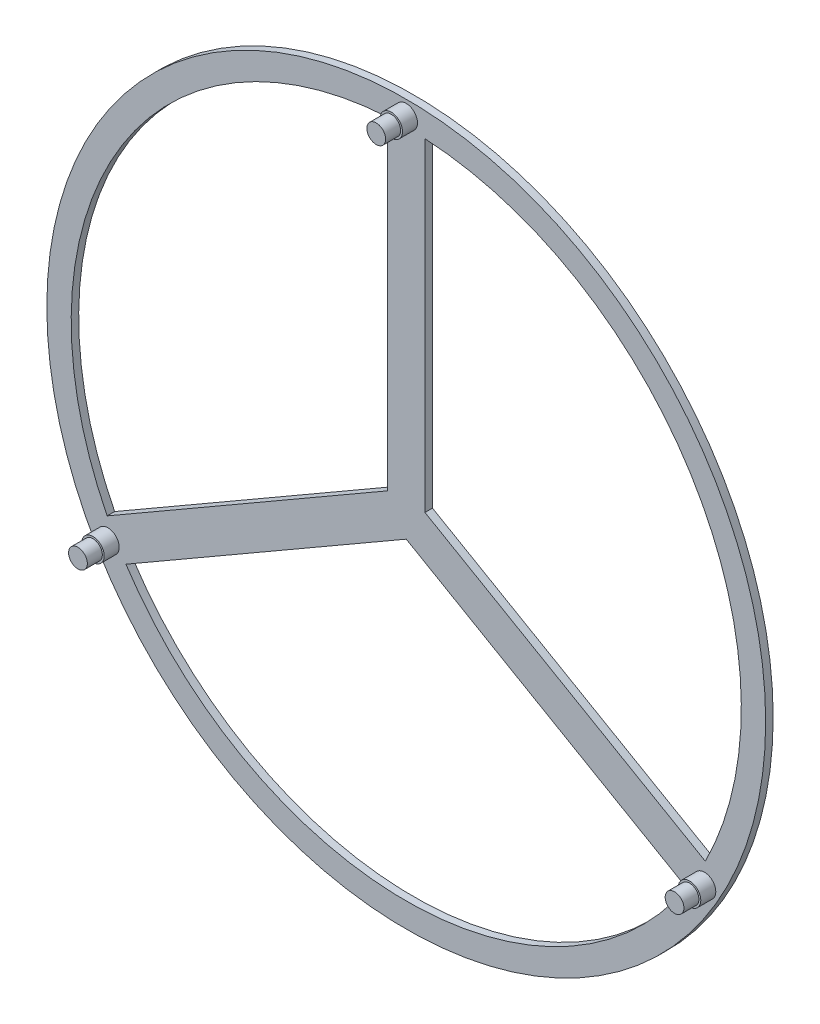
ISO-10303-21;
HEADER;
FILE_DESCRIPTION(('STEP AP214'),'2;1');
FILE_NAME('part.step','',(''),(''),'','','');
FILE_SCHEMA(('AUTOMOTIVE_DESIGN { 1 0 10303 214 1 1 1 1 }'));
ENDSEC;
DATA;
#1=APPLICATION_CONTEXT('core data for automotive mechanical design processes');
#2=APPLICATION_PROTOCOL_DEFINITION('international standard','automotive_design',2000,#1);
#3=PRODUCT_CONTEXT('',#1,'mechanical');
#4=PRODUCT('Part','Part','',(#3));
#5=PRODUCT_RELATED_PRODUCT_CATEGORY('part','',(#4));
#6=PRODUCT_DEFINITION_FORMATION('','',#4);
#7=PRODUCT_DEFINITION_CONTEXT('part definition',#1,'design');
#8=PRODUCT_DEFINITION('design','',#6,#7);
#9=PRODUCT_DEFINITION_SHAPE('','',#8);
#10=(LENGTH_UNIT() NAMED_UNIT(*) SI_UNIT(.MILLI.,.METRE.));
#11=(NAMED_UNIT(*) PLANE_ANGLE_UNIT() SI_UNIT($,.RADIAN.));
#12=(NAMED_UNIT(*) SI_UNIT($,.STERADIAN.) SOLID_ANGLE_UNIT());
#13=UNCERTAINTY_MEASURE_WITH_UNIT(LENGTH_MEASURE(1.E-05),#10,'distance_accuracy_value','');
#14=(GEOMETRIC_REPRESENTATION_CONTEXT(3) GLOBAL_UNCERTAINTY_ASSIGNED_CONTEXT((#13)) GLOBAL_UNIT_ASSIGNED_CONTEXT((#10,
#11,#12)) REPRESENTATION_CONTEXT('',''));
#15=CARTESIAN_POINT('',(0.,0.,0.));
#16=DIRECTION('',(0.,0.,1.));
#17=DIRECTION('',(1.,0.,0.));
#18=AXIS2_PLACEMENT_3D('',#15,#16,#17);
#19=CARTESIAN_POINT('',(-6.03407455454744,0.,-40.));
#20=DIRECTION('',(0.,0.,1.));
#21=DIRECTION('',(1.,0.,0.));
#22=AXIS2_PLACEMENT_3D('',#19,#20,#21);
#23=CYLINDRICAL_SURFACE('',#22,1787.01308650755);
#24=CARTESIAN_POINT('',(-6.03407455454744,0.,0.));
#25=DIRECTION('',(0.,0.,1.));
#26=DIRECTION('',(1.,0.,0.));
#27=AXIS2_PLACEMENT_3D('',#24,#25,#26);
#28=CIRCLE('',#27,1787.01308650755);
#29=CARTESIAN_POINT('',(-1501.20779569788,-978.709004225282,0.));
#30=VERTEX_POINT('',#29);
#31=CARTESIAN_POINT('',(1489.13964658878,-978.709004225282,0.));
#32=VERTEX_POINT('',#31);
#33=EDGE_CURVE('E166',#30,#32,#28,.T.);
#34=ORIENTED_EDGE('',*,*,#33,.T.);
#35=DIRECTION('',(0.,0.,1.));
#36=VECTOR('',#35,1.);
#37=CARTESIAN_POINT('',(1489.13964658878,-978.709004225282,-40.));
#38=LINE('',#37,#36);
#39=CARTESIAN_POINT('',(1489.13964658878,-978.709004225282,-40.));
#40=VERTEX_POINT('',#39);
#41=EDGE_CURVE('E102',#40,#32,#38,.T.);
#42=ORIENTED_EDGE('',*,*,#41,.F.);
#43=CARTESIAN_POINT('',(-6.03407455454744,0.,-40.));
#44=DIRECTION('',(0.,0.,1.));
#45=DIRECTION('',(1.,0.,0.));
#46=AXIS2_PLACEMENT_3D('',#43,#44,#45);
#47=CIRCLE('',#46,1787.01308650755);
#48=CARTESIAN_POINT('',(-1501.20779569788,-978.709004225282,-40.));
#49=VERTEX_POINT('',#48);
#50=EDGE_CURVE('E64',#49,#40,#47,.T.);
#51=ORIENTED_EDGE('',*,*,#50,.F.);
#52=DIRECTION('',(0.,0.,1.));
#53=VECTOR('',#52,1.);
#54=CARTESIAN_POINT('',(-1501.20779569788,-978.709004225282,-40.));
#55=LINE('',#54,#53);
#56=EDGE_CURVE('E133',#49,#30,#55,.T.);
#57=ORIENTED_EDGE('',*,*,#56,.T.);
#58=EDGE_LOOP('',(#34,#42,#51,#57));
#59=FACE_BOUND('',#58,.T.);
#60=ADVANCED_FACE('F47',(#59),#23,.F.);
#61=CARTESIAN_POINT('',(-51.5085186386369,-89.2153713047276,-40.));
#62=DIRECTION('',(-0.5,-0.866025403784439,0.));
#63=DIRECTION('',(0.866025403784439,-0.5,0.));
#64=AXIS2_PLACEMENT_3D('',#61,#62,#63);
#65=PLANE('',#64);
#66=DIRECTION('',(0.866025403784439,-0.5,0.));
#67=VECTOR('',#66,1.);
#68=CARTESIAN_POINT('',(-51.5085186386369,-89.2153713047276,0.));
#69=LINE('',#68,#67);
#70=CARTESIAN_POINT('',(-6.03407455454753,-115.470053837925,0.));
#71=VERTEX_POINT('',#70);
#72=EDGE_CURVE('E169',#71,#32,#69,.T.);
#73=ORIENTED_EDGE('',*,*,#72,.F.);
#74=DIRECTION('',(0.,0.,1.));
#75=VECTOR('',#74,1.);
#76=CARTESIAN_POINT('',(-6.03407455454753,-115.470053837925,-40.));
#77=LINE('',#76,#75);
#78=CARTESIAN_POINT('',(-6.03407455454753,-115.470053837925,-40.));
#79=VERTEX_POINT('',#78);
#80=EDGE_CURVE('E95',#79,#71,#77,.T.);
#81=ORIENTED_EDGE('',*,*,#80,.F.);
#82=DIRECTION('',(0.866025403784439,-0.5,0.));
#83=VECTOR('',#82,1.);
#84=CARTESIAN_POINT('',(-51.5085186386369,-89.2153713047276,-40.));
#85=LINE('',#84,#83);
#86=EDGE_CURVE('E130',#79,#40,#85,.T.);
#87=ORIENTED_EDGE('',*,*,#86,.T.);
#88=ORIENTED_EDGE('',*,*,#41,.T.);
#89=EDGE_LOOP('',(#73,#81,#87,#88));
#90=FACE_BOUND('',#89,.T.);
#91=ADVANCED_FACE('F271',(#90),#65,.T.);
#92=CARTESIAN_POINT('',(-6.03407455454744,0.,-40.));
#93=DIRECTION('',(0.,0.,1.));
#94=DIRECTION('',(1.,0.,0.));
#95=AXIS2_PLACEMENT_3D('',#92,#93,#94);
#96=CYLINDRICAL_SURFACE('',#95,1787.01308650755);
#97=CARTESIAN_POINT('',(-6.03407455454744,0.,0.));
#98=DIRECTION('',(0.,0.,1.));
#99=DIRECTION('',(1.,0.,0.));
#100=AXIS2_PLACEMENT_3D('',#97,#98,#99);
#101=CIRCLE('',#100,1787.01308650755);
#102=CARTESIAN_POINT('',(-106.034074554547,1784.21292769368,0.));
#103=VERTEX_POINT('',#102);
#104=CARTESIAN_POINT('',(-1601.20779569788,-805.503923468395,0.));
#105=VERTEX_POINT('',#104);
#106=EDGE_CURVE('E159',#103,#105,#101,.T.);
#107=ORIENTED_EDGE('',*,*,#106,.T.);
#108=DIRECTION('',(0.,0.,1.));
#109=VECTOR('',#108,1.);
#110=CARTESIAN_POINT('',(-1601.20779569788,-805.503923468395,-40.));
#111=LINE('',#110,#109);
#112=CARTESIAN_POINT('',(-1601.20779569788,-805.503923468395,-40.));
#113=VERTEX_POINT('',#112);
#114=EDGE_CURVE('E138',#113,#105,#111,.T.);
#115=ORIENTED_EDGE('',*,*,#114,.F.);
#116=CARTESIAN_POINT('',(-6.03407455454744,0.,-40.));
#117=DIRECTION('',(0.,0.,1.));
#118=DIRECTION('',(1.,0.,0.));
#119=AXIS2_PLACEMENT_3D('',#116,#117,#118);
#120=CIRCLE('',#119,1787.01308650755);
#121=CARTESIAN_POINT('',(-106.034074554547,1784.21292769368,-40.));
#122=VERTEX_POINT('',#121);
#123=EDGE_CURVE('E232',#122,#113,#120,.T.);
#124=ORIENTED_EDGE('',*,*,#123,.F.);
#125=DIRECTION('',(0.,0.,1.));
#126=VECTOR('',#125,1.);
#127=CARTESIAN_POINT('',(-106.034074554547,1784.21292769368,-40.));
#128=LINE('',#127,#126);
#129=EDGE_CURVE('E184',#122,#103,#128,.T.);
#130=ORIENTED_EDGE('',*,*,#129,.T.);
#131=EDGE_LOOP('',(#107,#115,#124,#130));
#132=FACE_BOUND('',#131,.T.);
#133=ADVANCED_FACE('F245',(#132),#96,.F.);
#134=CARTESIAN_POINT('',(-51.5085186386369,89.2153713047276,-40.));
#135=DIRECTION('',(0.5,-0.866025403784439,0.));
#136=DIRECTION('',(0.866025403784439,0.5,0.));
#137=AXIS2_PLACEMENT_3D('',#134,#135,#136);
#138=PLANE('',#137);
#139=DIRECTION('',(0.866025403784439,0.5,0.));
#140=VECTOR('',#139,1.);
#141=CARTESIAN_POINT('',(-51.5085186386369,89.2153713047276,0.));
#142=LINE('',#141,#140);
#143=CARTESIAN_POINT('',(-106.034074554547,57.7350269189626,0.));
#144=VERTEX_POINT('',#143);
#145=EDGE_CURVE('E164',#105,#144,#142,.T.);
#146=ORIENTED_EDGE('',*,*,#145,.T.);
#147=DIRECTION('',(0.,0.,1.));
#148=VECTOR('',#147,1.);
#149=CARTESIAN_POINT('',(-106.034074554547,57.7350269189626,-40.));
#150=LINE('',#149,#148);
#151=CARTESIAN_POINT('',(-106.034074554547,57.7350269189626,-40.));
#152=VERTEX_POINT('',#151);
#153=EDGE_CURVE('E181',#152,#144,#150,.T.);
#154=ORIENTED_EDGE('',*,*,#153,.F.);
#155=DIRECTION('',(0.866025403784439,0.5,0.));
#156=VECTOR('',#155,1.);
#157=CARTESIAN_POINT('',(-51.5085186386369,89.2153713047276,-40.));
#158=LINE('',#157,#156);
#159=EDGE_CURVE('E140',#113,#152,#158,.T.);
#160=ORIENTED_EDGE('',*,*,#159,.F.);
#161=ORIENTED_EDGE('',*,*,#114,.T.);
#162=EDGE_LOOP('',(#146,#154,#160,#161));
#163=FACE_BOUND('',#162,.T.);
#164=ADVANCED_FACE('F247',(#163),#138,.F.);
#165=CARTESIAN_POINT('',(93.9659254454526,0.,-40.));
#166=DIRECTION('',(-1.,0.,0.));
#167=DIRECTION('',(0.,0.,1.));
#168=AXIS2_PLACEMENT_3D('',#165,#166,#167);
#169=PLANE('',#168);
#170=DIRECTION('',(0.,-1.,0.));
#171=VECTOR('',#170,1.);
#172=CARTESIAN_POINT('',(93.9659254454526,0.,0.));
#173=LINE('',#172,#171);
#174=CARTESIAN_POINT('',(93.9659254454526,1784.21292769368,0.));
#175=VERTEX_POINT('',#174);
#176=CARTESIAN_POINT('',(93.9659254454526,57.7350269189626,0.));
#177=VERTEX_POINT('',#176);
#178=EDGE_CURVE('E151',#175,#177,#173,.T.);
#179=ORIENTED_EDGE('',*,*,#178,.T.);
#180=DIRECTION('',(0.,0.,1.));
#181=VECTOR('',#180,1.);
#182=CARTESIAN_POINT('',(93.9659254454526,57.7350269189626,-40.));
#183=LINE('',#182,#181);
#184=CARTESIAN_POINT('',(93.9659254454526,57.7350269189626,-40.));
#185=VERTEX_POINT('',#184);
#186=EDGE_CURVE('E187',#185,#177,#183,.T.);
#187=ORIENTED_EDGE('',*,*,#186,.F.);
#188=DIRECTION('',(0.,-1.,0.));
#189=VECTOR('',#188,1.);
#190=CARTESIAN_POINT('',(93.9659254454526,0.,-40.));
#191=LINE('',#190,#189);
#192=CARTESIAN_POINT('',(93.9659254454526,1784.21292769368,-40.));
#193=VERTEX_POINT('',#192);
#194=EDGE_CURVE('E175',#193,#185,#191,.T.);
#195=ORIENTED_EDGE('',*,*,#194,.F.);
#196=DIRECTION('',(0.,0.,1.));
#197=VECTOR('',#196,1.);
#198=CARTESIAN_POINT('',(93.9659254454526,1784.21292769368,-40.));
#199=LINE('',#198,#197);
#200=EDGE_CURVE('E150',#193,#175,#199,.T.);
#201=ORIENTED_EDGE('',*,*,#200,.T.);
#202=EDGE_LOOP('',(#179,#187,#195,#201));
#203=FACE_BOUND('',#202,.T.);
#204=ADVANCED_FACE('F49',(#203),#169,.F.);
#205=CARTESIAN_POINT('',(48.4914813613631,83.9897094521602,-40.));
#206=DIRECTION('',(-0.5,-0.866025403784439,0.));
#207=DIRECTION('',(0.866025403784439,-0.5,0.));
#208=AXIS2_PLACEMENT_3D('',#205,#206,#207);
#209=PLANE('',#208);
#210=DIRECTION('',(0.866025403784439,-0.5,0.));
#211=VECTOR('',#210,1.);
#212=CARTESIAN_POINT('',(48.4914813613631,83.9897094521602,0.));
#213=LINE('',#212,#211);
#214=CARTESIAN_POINT('',(1589.13964658878,-805.503923468395,0.));
#215=VERTEX_POINT('',#214);
#216=EDGE_CURVE('E157',#177,#215,#213,.T.);
#217=ORIENTED_EDGE('',*,*,#216,.T.);
#218=DIRECTION('',(0.,0.,1.));
#219=VECTOR('',#218,1.);
#220=CARTESIAN_POINT('',(1589.13964658878,-805.503923468395,-40.));
#221=LINE('',#220,#219);
#222=CARTESIAN_POINT('',(1589.13964658878,-805.503923468395,-40.));
#223=VERTEX_POINT('',#222);
#224=EDGE_CURVE('E190',#223,#215,#221,.T.);
#225=ORIENTED_EDGE('',*,*,#224,.F.);
#226=DIRECTION('',(0.866025403784439,-0.5,0.));
#227=VECTOR('',#226,1.);
#228=CARTESIAN_POINT('',(48.4914813613631,83.9897094521602,-40.));
#229=LINE('',#228,#227);
#230=EDGE_CURVE('E230',#185,#223,#229,.T.);
#231=ORIENTED_EDGE('',*,*,#230,.F.);
#232=ORIENTED_EDGE('',*,*,#186,.T.);
#233=EDGE_LOOP('',(#217,#225,#231,#232));
#234=FACE_BOUND('',#233,.T.);
#235=ADVANCED_FACE('F284',(#234),#209,.F.);
#236=CARTESIAN_POINT('',(48.4914813613631,-83.9897094521602,-40.));
#237=DIRECTION('',(-0.5,0.866025403784439,0.));
#238=DIRECTION('',(-0.866025403784439,-0.5,0.));
#239=AXIS2_PLACEMENT_3D('',#236,#237,#238);
#240=PLANE('',#239);
#241=DIRECTION('',(-0.866025403784439,-0.5,0.));
#242=VECTOR('',#241,1.);
#243=CARTESIAN_POINT('',(48.4914813613631,-83.9897094521602,0.));
#244=LINE('',#243,#242);
#245=EDGE_CURVE('E135',#71,#30,#244,.T.);
#246=ORIENTED_EDGE('',*,*,#245,.T.);
#247=ORIENTED_EDGE('',*,*,#56,.F.);
#248=DIRECTION('',(-0.866025403784439,-0.5,0.));
#249=VECTOR('',#248,1.);
#250=CARTESIAN_POINT('',(48.4914813613631,-83.9897094521602,-40.));
#251=LINE('',#250,#249);
#252=EDGE_CURVE('E126',#79,#49,#251,.T.);
#253=ORIENTED_EDGE('',*,*,#252,.F.);
#254=ORIENTED_EDGE('',*,*,#80,.T.);
#255=EDGE_LOOP('',(#246,#247,#253,#254));
#256=FACE_BOUND('',#255,.T.);
#257=ADVANCED_FACE('F134',(#256),#240,.F.);
#258=CARTESIAN_POINT('',(-106.034074554547,0.,-40.));
#259=DIRECTION('',(1.,0.,0.));
#260=DIRECTION('',(0.,0.,-1.));
#261=AXIS2_PLACEMENT_3D('',#258,#259,#260);
#262=PLANE('',#261);
#263=DIRECTION('',(0.,1.,0.));
#264=VECTOR('',#263,1.);
#265=CARTESIAN_POINT('',(-106.034074554547,0.,0.));
#266=LINE('',#265,#264);
#267=EDGE_CURVE('E162',#144,#103,#266,.T.);
#268=ORIENTED_EDGE('',*,*,#267,.T.);
#269=ORIENTED_EDGE('',*,*,#129,.F.);
#270=DIRECTION('',(0.,1.,0.));
#271=VECTOR('',#270,1.);
#272=CARTESIAN_POINT('',(-106.034074554547,0.,-40.));
#273=LINE('',#272,#271);
#274=EDGE_CURVE('E142',#152,#122,#273,.T.);
#275=ORIENTED_EDGE('',*,*,#274,.F.);
#276=ORIENTED_EDGE('',*,*,#153,.T.);
#277=EDGE_LOOP('',(#268,#269,#275,#276));
#278=FACE_BOUND('',#277,.T.);
#279=ADVANCED_FACE('F241',(#278),#262,.F.);
#280=CARTESIAN_POINT('',(-6.03407455454744,0.,-40.));
#281=DIRECTION('',(0.,0.,1.));
#282=DIRECTION('',(1.,0.,0.));
#283=AXIS2_PLACEMENT_3D('',#280,#281,#282);
#284=CYLINDRICAL_SURFACE('',#283,1787.01308650755);
#285=CARTESIAN_POINT('',(-6.03407455454744,0.,0.));
#286=DIRECTION('',(0.,0.,1.));
#287=DIRECTION('',(1.,0.,0.));
#288=AXIS2_PLACEMENT_3D('',#285,#286,#287);
#289=CIRCLE('',#288,1787.01308650755);
#290=EDGE_CURVE('E154',#215,#175,#289,.T.);
#291=ORIENTED_EDGE('',*,*,#290,.T.);
#292=ORIENTED_EDGE('',*,*,#200,.F.);
#293=CARTESIAN_POINT('',(-6.03407455454744,0.,-40.));
#294=DIRECTION('',(0.,0.,1.));
#295=DIRECTION('',(1.,0.,0.));
#296=AXIS2_PLACEMENT_3D('',#293,#294,#295);
#297=CIRCLE('',#296,1787.01308650755);
#298=EDGE_CURVE('E111',#223,#193,#297,.T.);
#299=ORIENTED_EDGE('',*,*,#298,.F.);
#300=ORIENTED_EDGE('',*,*,#224,.T.);
#301=EDGE_LOOP('',(#291,#292,#299,#300));
#302=FACE_BOUND('',#301,.T.);
#303=ADVANCED_FACE('F260',(#302),#284,.F.);
#304=CARTESIAN_POINT('',(-6.03407455454744,0.,-40.));
#305=DIRECTION('',(0.,0.,1.));
#306=DIRECTION('',(1.,0.,0.));
#307=AXIS2_PLACEMENT_3D('',#304,#305,#306);
#308=CYLINDRICAL_SURFACE('',#307,1917.01308650755);
#309=CARTESIAN_POINT('',(-6.03407455454744,0.,-40.));
#310=DIRECTION('',(0.,0.,1.));
#311=DIRECTION('',(1.,0.,0.));
#312=AXIS2_PLACEMENT_3D('',#309,#310,#311);
#313=CIRCLE('',#312,1917.01308650755);
#314=CARTESIAN_POINT('',(1910.979011953,0.,-40.));
#315=VERTEX_POINT('',#314);
#316=EDGE_CURVE('E147',#315,#315,#313,.T.);
#317=ORIENTED_EDGE('',*,*,#316,.T.);
#318=EDGE_LOOP('',(#317));
#319=FACE_BOUND('',#318,.T.);
#320=CARTESIAN_POINT('',(-6.03407455454744,0.,0.));
#321=DIRECTION('',(0.,0.,1.));
#322=DIRECTION('',(1.,0.,0.));
#323=AXIS2_PLACEMENT_3D('',#320,#321,#322);
#324=CIRCLE('',#323,1917.01308650755);
#325=CARTESIAN_POINT('',(1910.979011953,0.,0.));
#326=VERTEX_POINT('',#325);
#327=EDGE_CURVE('E172',#326,#326,#324,.T.);
#328=ORIENTED_EDGE('',*,*,#327,.F.);
#329=EDGE_LOOP('',(#328));
#330=FACE_BOUND('',#329,.T.);
#331=ADVANCED_FACE('F258',(#319,#330),#308,.T.);
#332=CARTESIAN_POINT('',(0.,0.,-40.));
#333=DIRECTION('',(0.,0.,1.));
#334=DIRECTION('',(1.,0.,0.));
#335=AXIS2_PLACEMENT_3D('',#332,#333,#334);
#336=PLANE('',#335);
#337=ORIENTED_EDGE('',*,*,#194,.T.);
#338=ORIENTED_EDGE('',*,*,#230,.T.);
#339=ORIENTED_EDGE('',*,*,#298,.T.);
#340=EDGE_LOOP('',(#337,#338,#339));
#341=FACE_BOUND('',#340,.T.);
#342=ORIENTED_EDGE('',*,*,#123,.T.);
#343=ORIENTED_EDGE('',*,*,#159,.T.);
#344=ORIENTED_EDGE('',*,*,#274,.T.);
#345=EDGE_LOOP('',(#342,#343,#344));
#346=FACE_BOUND('',#345,.T.);
#347=ORIENTED_EDGE('',*,*,#50,.T.);
#348=ORIENTED_EDGE('',*,*,#86,.F.);
#349=ORIENTED_EDGE('',*,*,#252,.T.);
#350=EDGE_LOOP('',(#347,#348,#349));
#351=FACE_BOUND('',#350,.T.);
#352=ORIENTED_EDGE('',*,*,#316,.F.);
#353=EDGE_LOOP('',(#352));
#354=FACE_BOUND('',#353,.T.);
#355=ADVANCED_FACE('F128',(#341,#346,#351,#354),#336,.F.);
#356=CARTESIAN_POINT('',(0.,0.,0.));
#357=DIRECTION('',(0.,0.,1.));
#358=DIRECTION('',(1.,0.,0.));
#359=AXIS2_PLACEMENT_3D('',#356,#357,#358);
#360=PLANE('',#359);
#361=CARTESIAN_POINT('',(-1596.93407455455,-918.506543253775,0.));
#362=DIRECTION('',(0.,0.,1.));
#363=DIRECTION('',(1.,0.,0.));
#364=AXIS2_PLACEMENT_3D('',#361,#362,#363);
#365=CIRCLE('',#364,60.0000000000001);
#366=CARTESIAN_POINT('',(-1536.93407455455,-918.506543253775,0.));
#367=VERTEX_POINT('',#366);
#368=EDGE_CURVE('E13',#367,#367,#365,.T.);
#369=ORIENTED_EDGE('',*,*,#368,.F.);
#370=EDGE_LOOP('',(#369));
#371=FACE_BOUND('',#370,.T.);
#372=CARTESIAN_POINT('',(1584.86592544545,-918.506543253775,0.));
#373=DIRECTION('',(0.,0.,1.));
#374=DIRECTION('',(1.,0.,0.));
#375=AXIS2_PLACEMENT_3D('',#372,#373,#374);
#376=CIRCLE('',#375,60.0000000000001);
#377=CARTESIAN_POINT('',(1644.86592544545,-918.506543253775,0.));
#378=VERTEX_POINT('',#377);
#379=EDGE_CURVE('E56',#378,#378,#376,.T.);
#380=ORIENTED_EDGE('',*,*,#379,.F.);
#381=EDGE_LOOP('',(#380));
#382=FACE_BOUND('',#381,.T.);
#383=CARTESIAN_POINT('',(-6.03407455454744,1837.01308650755,0.));
#384=DIRECTION('',(0.,0.,1.));
#385=DIRECTION('',(1.,0.,0.));
#386=AXIS2_PLACEMENT_3D('',#383,#384,#385);
#387=CIRCLE('',#386,60.0000000000001);
#388=CARTESIAN_POINT('',(53.9659254454527,1837.01308650755,0.));
#389=VERTEX_POINT('',#388);
#390=EDGE_CURVE('E177',#389,#389,#387,.T.);
#391=ORIENTED_EDGE('',*,*,#390,.F.);
#392=EDGE_LOOP('',(#391));
#393=FACE_BOUND('',#392,.T.);
#394=ORIENTED_EDGE('',*,*,#178,.F.);
#395=ORIENTED_EDGE('',*,*,#290,.F.);
#396=ORIENTED_EDGE('',*,*,#216,.F.);
#397=EDGE_LOOP('',(#394,#395,#396));
#398=FACE_BOUND('',#397,.T.);
#399=ORIENTED_EDGE('',*,*,#106,.F.);
#400=ORIENTED_EDGE('',*,*,#267,.F.);
#401=ORIENTED_EDGE('',*,*,#145,.F.);
#402=EDGE_LOOP('',(#399,#400,#401));
#403=FACE_BOUND('',#402,.T.);
#404=ORIENTED_EDGE('',*,*,#33,.F.);
#405=ORIENTED_EDGE('',*,*,#245,.F.);
#406=ORIENTED_EDGE('',*,*,#72,.T.);
#407=EDGE_LOOP('',(#404,#405,#406));
#408=FACE_BOUND('',#407,.T.);
#409=ORIENTED_EDGE('',*,*,#327,.T.);
#410=EDGE_LOOP('',(#409));
#411=FACE_BOUND('',#410,.T.);
#412=ADVANCED_FACE('F249',(#371,#382,#393,#398,#403,#408,#411),#360,.T.);
#413=CARTESIAN_POINT('',(-6.03407455454744,1837.01308650755,-10.));
#414=DIRECTION('',(0.,0.,1.));
#415=DIRECTION('',(1.,0.,0.));
#416=AXIS2_PLACEMENT_3D('',#413,#414,#415);
#417=CYLINDRICAL_SURFACE('',#416,60.0000000000001);
#418=ORIENTED_EDGE('',*,*,#390,.T.);
#419=EDGE_LOOP('',(#418));
#420=FACE_BOUND('',#419,.T.);
#421=CARTESIAN_POINT('',(-6.03407455454744,1837.01308650755,80.));
#422=DIRECTION('',(0.,0.,1.));
#423=DIRECTION('',(1.,0.,0.));
#424=AXIS2_PLACEMENT_3D('',#421,#422,#423);
#425=CIRCLE('',#424,60.0000000000001);
#426=CARTESIAN_POINT('',(53.9659254454527,1837.01308650755,80.));
#427=VERTEX_POINT('',#426);
#428=EDGE_CURVE('E199',#427,#427,#425,.T.);
#429=ORIENTED_EDGE('',*,*,#428,.F.);
#430=EDGE_LOOP('',(#429));
#431=FACE_BOUND('',#430,.T.);
#432=ADVANCED_FACE('F252',(#420,#431),#417,.T.);
#433=CARTESIAN_POINT('',(-6.03407455454744,1837.01308650755,80.));
#434=DIRECTION('',(0.,0.,1.));
#435=DIRECTION('',(1.,0.,0.));
#436=AXIS2_PLACEMENT_3D('',#433,#434,#435);
#437=PLANE('',#436);
#438=CARTESIAN_POINT('',(-6.03407455454744,1837.01308650755,80.));
#439=DIRECTION('',(0.,0.,1.));
#440=DIRECTION('',(1.,0.,0.));
#441=AXIS2_PLACEMENT_3D('',#438,#439,#440);
#442=CIRCLE('',#441,50.0000000000001);
#443=CARTESIAN_POINT('',(43.9659254454526,1837.01308650755,80.));
#444=VERTEX_POINT('',#443);
#445=EDGE_CURVE('E195',#444,#444,#442,.T.);
#446=ORIENTED_EDGE('',*,*,#445,.F.);
#447=EDGE_LOOP('',(#446));
#448=FACE_BOUND('',#447,.T.);
#449=ORIENTED_EDGE('',*,*,#428,.T.);
#450=EDGE_LOOP('',(#449));
#451=FACE_BOUND('',#450,.T.);
#452=ADVANCED_FACE('F408',(#448,#451),#437,.T.);
#453=CARTESIAN_POINT('',(-6.03407455454744,1837.01308650755,160.));
#454=DIRECTION('',(0.,0.,1.));
#455=DIRECTION('',(1.,0.,0.));
#456=AXIS2_PLACEMENT_3D('',#453,#454,#455);
#457=PLANE('',#456);
#458=CARTESIAN_POINT('',(-6.03407455454744,1837.01308650755,160.));
#459=DIRECTION('',(0.,0.,1.));
#460=DIRECTION('',(1.,0.,0.));
#461=AXIS2_PLACEMENT_3D('',#458,#459,#460);
#462=CIRCLE('',#461,50.0000000000001);
#463=CARTESIAN_POINT('',(43.9659254454526,1837.01308650755,160.));
#464=VERTEX_POINT('',#463);
#465=EDGE_CURVE('E223',#464,#464,#462,.T.);
#466=ORIENTED_EDGE('',*,*,#465,.T.);
#467=EDGE_LOOP('',(#466));
#468=FACE_BOUND('',#467,.T.);
#469=ADVANCED_FACE('F398',(#468),#457,.T.);
#470=CARTESIAN_POINT('',(-6.03407455454744,1837.01308650755,160.));
#471=DIRECTION('',(0.,0.,-1.));
#472=DIRECTION('',(-1.,0.,0.));
#473=AXIS2_PLACEMENT_3D('',#470,#471,#472);
#474=CYLINDRICAL_SURFACE('',#473,50.0000000000001);
#475=ORIENTED_EDGE('',*,*,#445,.T.);
#476=EDGE_LOOP('',(#475));
#477=FACE_BOUND('',#476,.T.);
#478=ORIENTED_EDGE('',*,*,#465,.F.);
#479=EDGE_LOOP('',(#478));
#480=FACE_BOUND('',#479,.T.);
#481=ADVANCED_FACE('F391',(#477,#480),#474,.T.);
#482=CARTESIAN_POINT('',(1584.86592544545,-918.506543253775,-10.));
#483=DIRECTION('',(0.,0.,1.));
#484=DIRECTION('',(1.,0.,0.));
#485=AXIS2_PLACEMENT_3D('',#482,#483,#484);
#486=CYLINDRICAL_SURFACE('',#485,60.0000000000001);
#487=ORIENTED_EDGE('',*,*,#379,.T.);
#488=EDGE_LOOP('',(#487));
#489=FACE_BOUND('',#488,.T.);
#490=CARTESIAN_POINT('',(1584.86592544545,-918.506543253775,80.));
#491=DIRECTION('',(0.,0.,1.));
#492=DIRECTION('',(1.,0.,0.));
#493=AXIS2_PLACEMENT_3D('',#490,#491,#492);
#494=CIRCLE('',#493,60.0000000000001);
#495=CARTESIAN_POINT('',(1644.86592544545,-918.506543253775,80.));
#496=VERTEX_POINT('',#495);
#497=EDGE_CURVE('E205',#496,#496,#494,.T.);
#498=ORIENTED_EDGE('',*,*,#497,.F.);
#499=EDGE_LOOP('',(#498));
#500=FACE_BOUND('',#499,.T.);
#501=ADVANCED_FACE('F397',(#489,#500),#486,.T.);
#502=CARTESIAN_POINT('',(1584.86592544545,-918.506543253775,80.));
#503=DIRECTION('',(0.,0.,1.));
#504=DIRECTION('',(1.,0.,0.));
#505=AXIS2_PLACEMENT_3D('',#502,#503,#504);
#506=PLANE('',#505);
#507=CARTESIAN_POINT('',(1584.86592544545,-918.506543253775,80.));
#508=DIRECTION('',(0.,0.,1.));
#509=DIRECTION('',(1.,0.,0.));
#510=AXIS2_PLACEMENT_3D('',#507,#508,#509);
#511=CIRCLE('',#510,50.);
#512=CARTESIAN_POINT('',(1634.86592544545,-918.506543253775,80.));
#513=VERTEX_POINT('',#512);
#514=EDGE_CURVE('E202',#513,#513,#511,.T.);
#515=ORIENTED_EDGE('',*,*,#514,.F.);
#516=EDGE_LOOP('',(#515));
#517=FACE_BOUND('',#516,.T.);
#518=ORIENTED_EDGE('',*,*,#497,.T.);
#519=EDGE_LOOP('',(#518));
#520=FACE_BOUND('',#519,.T.);
#521=ADVANCED_FACE('F386',(#517,#520),#506,.T.);
#522=CARTESIAN_POINT('',(1584.86592544545,-918.506543253775,160.));
#523=DIRECTION('',(0.,0.,1.));
#524=DIRECTION('',(1.,0.,0.));
#525=AXIS2_PLACEMENT_3D('',#522,#523,#524);
#526=PLANE('',#525);
#527=CARTESIAN_POINT('',(1584.86592544545,-918.506543253775,160.));
#528=DIRECTION('',(0.,0.,1.));
#529=DIRECTION('',(1.,0.,0.));
#530=AXIS2_PLACEMENT_3D('',#527,#528,#529);
#531=CIRCLE('',#530,50.);
#532=CARTESIAN_POINT('',(1634.86592544545,-918.506543253775,160.));
#533=VERTEX_POINT('',#532);
#534=EDGE_CURVE('E155',#533,#533,#531,.T.);
#535=ORIENTED_EDGE('',*,*,#534,.T.);
#536=EDGE_LOOP('',(#535));
#537=FACE_BOUND('',#536,.T.);
#538=ADVANCED_FACE('F376',(#537),#526,.T.);
#539=CARTESIAN_POINT('',(1584.86592544545,-918.506543253775,160.));
#540=DIRECTION('',(0.,0.,-1.));
#541=DIRECTION('',(-1.,0.,0.));
#542=AXIS2_PLACEMENT_3D('',#539,#540,#541);
#543=CYLINDRICAL_SURFACE('',#542,50.);
#544=ORIENTED_EDGE('',*,*,#514,.T.);
#545=EDGE_LOOP('',(#544));
#546=FACE_BOUND('',#545,.T.);
#547=ORIENTED_EDGE('',*,*,#534,.F.);
#548=EDGE_LOOP('',(#547));
#549=FACE_BOUND('',#548,.T.);
#550=ADVANCED_FACE('F369',(#546,#549),#543,.T.);
#551=CARTESIAN_POINT('',(-1596.93407455455,-918.506543253775,-10.));
#552=DIRECTION('',(0.,0.,1.));
#553=DIRECTION('',(1.,0.,0.));
#554=AXIS2_PLACEMENT_3D('',#551,#552,#553);
#555=CYLINDRICAL_SURFACE('',#554,60.0000000000001);
#556=ORIENTED_EDGE('',*,*,#368,.T.);
#557=EDGE_LOOP('',(#556));
#558=FACE_BOUND('',#557,.T.);
#559=CARTESIAN_POINT('',(-1596.93407455455,-918.506543253775,80.));
#560=DIRECTION('',(0.,0.,1.));
#561=DIRECTION('',(1.,0.,0.));
#562=AXIS2_PLACEMENT_3D('',#559,#560,#561);
#563=CIRCLE('',#562,60.0000000000001);
#564=CARTESIAN_POINT('',(-1536.93407455455,-918.506543253775,80.));
#565=VERTEX_POINT('',#564);
#566=EDGE_CURVE('E209',#565,#565,#563,.T.);
#567=ORIENTED_EDGE('',*,*,#566,.F.);
#568=EDGE_LOOP('',(#567));
#569=FACE_BOUND('',#568,.T.);
#570=ADVANCED_FACE('F375',(#558,#569),#555,.T.);
#571=CARTESIAN_POINT('',(-1596.93407455455,-918.506543253775,80.));
#572=DIRECTION('',(0.,0.,1.));
#573=DIRECTION('',(1.,0.,0.));
#574=AXIS2_PLACEMENT_3D('',#571,#572,#573);
#575=PLANE('',#574);
#576=CARTESIAN_POINT('',(-1596.93407455455,-918.506543253775,80.));
#577=DIRECTION('',(0.,0.,1.));
#578=DIRECTION('',(1.,0.,0.));
#579=AXIS2_PLACEMENT_3D('',#576,#577,#578);
#580=CIRCLE('',#579,50.);
#581=CARTESIAN_POINT('',(-1546.93407455455,-918.506543253775,80.));
#582=VERTEX_POINT('',#581);
#583=EDGE_CURVE('E207',#582,#582,#580,.T.);
#584=ORIENTED_EDGE('',*,*,#583,.F.);
#585=EDGE_LOOP('',(#584));
#586=FACE_BOUND('',#585,.T.);
#587=ORIENTED_EDGE('',*,*,#566,.T.);
#588=EDGE_LOOP('',(#587));
#589=FACE_BOUND('',#588,.T.);
#590=ADVANCED_FACE('F426',(#586,#589),#575,.T.);
#591=CARTESIAN_POINT('',(-1596.93407455455,-918.506543253775,160.));
#592=DIRECTION('',(0.,0.,1.));
#593=DIRECTION('',(1.,0.,0.));
#594=AXIS2_PLACEMENT_3D('',#591,#592,#593);
#595=PLANE('',#594);
#596=CARTESIAN_POINT('',(-1596.93407455455,-918.506543253775,160.));
#597=DIRECTION('',(0.,0.,1.));
#598=DIRECTION('',(1.,0.,0.));
#599=AXIS2_PLACEMENT_3D('',#596,#597,#598);
#600=CIRCLE('',#599,50.);
#601=CARTESIAN_POINT('',(-1546.93407455455,-918.506543253775,160.));
#602=VERTEX_POINT('',#601);
#603=EDGE_CURVE('E198',#602,#602,#600,.T.);
#604=ORIENTED_EDGE('',*,*,#603,.T.);
#605=EDGE_LOOP('',(#604));
#606=FACE_BOUND('',#605,.T.);
#607=ADVANCED_FACE('F418',(#606),#595,.T.);
#608=CARTESIAN_POINT('',(-1596.93407455455,-918.506543253775,160.));
#609=DIRECTION('',(0.,0.,-1.));
#610=DIRECTION('',(-1.,0.,0.));
#611=AXIS2_PLACEMENT_3D('',#608,#609,#610);
#612=CYLINDRICAL_SURFACE('',#611,50.);
#613=ORIENTED_EDGE('',*,*,#583,.T.);
#614=EDGE_LOOP('',(#613));
#615=FACE_BOUND('',#614,.T.);
#616=ORIENTED_EDGE('',*,*,#603,.F.);
#617=EDGE_LOOP('',(#616));
#618=FACE_BOUND('',#617,.T.);
#619=ADVANCED_FACE('F412',(#615,#618),#612,.T.);
#620=CLOSED_SHELL('',(#60,#91,#133,#164,#204,#235,#257,#279,#303,#331,#355,#412,#432,#452,#469,
#481,#501,#521,#538,#550,#570,#590,#607,#619));
#621=MANIFOLD_SOLID_BREP('B2',#620);
#622=ADVANCED_BREP_SHAPE_REPRESENTATION('',(#18,#621),#14);
#623=SHAPE_DEFINITION_REPRESENTATION(#9,#622);
ENDSEC;
END-ISO-10303-21;
